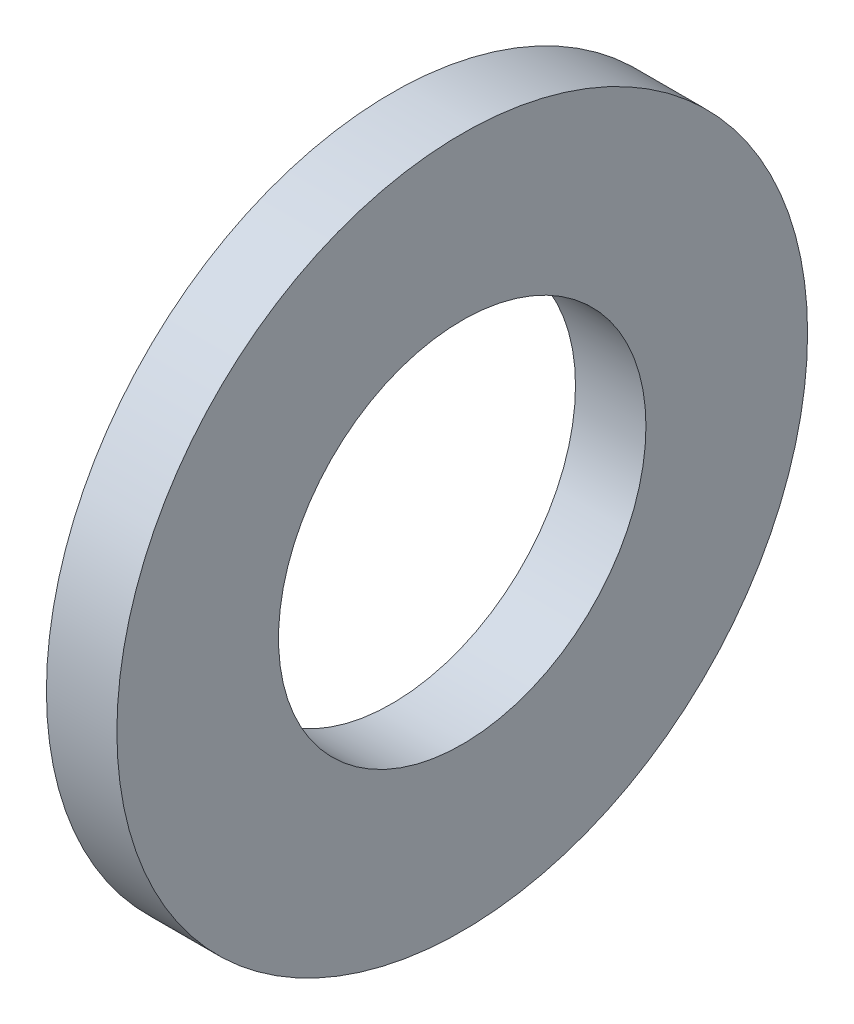
ISO-10303-21;
HEADER;
FILE_DESCRIPTION(('STEP AP214'),'2;1');
FILE_NAME('part.step','',(''),(''),'','','');
FILE_SCHEMA(('AUTOMOTIVE_DESIGN { 1 0 10303 214 1 1 1 1 }'));
ENDSEC;
DATA;
#1=APPLICATION_CONTEXT('core data for automotive mechanical design processes');
#2=APPLICATION_PROTOCOL_DEFINITION('international standard','automotive_design',2000,#1);
#3=PRODUCT_CONTEXT('',#1,'mechanical');
#4=PRODUCT('Part','Part','',(#3));
#5=PRODUCT_RELATED_PRODUCT_CATEGORY('part','',(#4));
#6=PRODUCT_DEFINITION_FORMATION('','',#4);
#7=PRODUCT_DEFINITION_CONTEXT('part definition',#1,'design');
#8=PRODUCT_DEFINITION('design','',#6,#7);
#9=PRODUCT_DEFINITION_SHAPE('','',#8);
#10=(LENGTH_UNIT() NAMED_UNIT(*) SI_UNIT(.MILLI.,.METRE.));
#11=(NAMED_UNIT(*) PLANE_ANGLE_UNIT() SI_UNIT($,.RADIAN.));
#12=(NAMED_UNIT(*) SI_UNIT($,.STERADIAN.) SOLID_ANGLE_UNIT());
#13=UNCERTAINTY_MEASURE_WITH_UNIT(LENGTH_MEASURE(1.E-05),#10,'distance_accuracy_value','');
#14=(GEOMETRIC_REPRESENTATION_CONTEXT(3) GLOBAL_UNCERTAINTY_ASSIGNED_CONTEXT((#13)) GLOBAL_UNIT_ASSIGNED_CONTEXT((#10,
#11,#12)) REPRESENTATION_CONTEXT('',''));
#15=CARTESIAN_POINT('',(0.,0.,0.));
#16=DIRECTION('',(0.,0.,1.));
#17=DIRECTION('',(1.,0.,0.));
#18=AXIS2_PLACEMENT_3D('',#15,#16,#17);
#19=CARTESIAN_POINT('',(1.2954,0.,0.));
#20=DIRECTION('',(1.,0.,0.));
#21=DIRECTION('',(0.,0.,-1.));
#22=AXIS2_PLACEMENT_3D('',#19,#20,#21);
#23=PLANE('',#22);
#24=CARTESIAN_POINT('',(1.2954,0.,0.));
#25=DIRECTION('',(1.,0.,0.));
#26=DIRECTION('',(0.,0.,-1.));
#27=AXIS2_PLACEMENT_3D('',#24,#25,#26);
#28=CIRCLE('',#27,6.35);
#29=CARTESIAN_POINT('',(1.2954,0.,-6.35));
#30=VERTEX_POINT('',#29);
#31=EDGE_CURVE('E10',#30,#30,#28,.T.);
#32=ORIENTED_EDGE('',*,*,#31,.T.);
#33=EDGE_LOOP('',(#32));
#34=FACE_BOUND('',#33,.T.);
#35=CARTESIAN_POINT('',(1.2954,0.,0.));
#36=DIRECTION('',(1.,0.,0.));
#37=DIRECTION('',(0.,0.,-1.));
#38=AXIS2_PLACEMENT_3D('',#35,#36,#37);
#39=CIRCLE('',#38,3.3782);
#40=CARTESIAN_POINT('',(1.2954,0.,-3.3782));
#41=VERTEX_POINT('',#40);
#42=EDGE_CURVE('E44',#41,#41,#39,.T.);
#43=ORIENTED_EDGE('',*,*,#42,.F.);
#44=EDGE_LOOP('',(#43));
#45=FACE_BOUND('',#44,.T.);
#46=ADVANCED_FACE('F33',(#34,#45),#23,.T.);
#47=CARTESIAN_POINT('',(0.,0.,0.));
#48=DIRECTION('',(1.,0.,0.));
#49=DIRECTION('',(0.,0.,-1.));
#50=AXIS2_PLACEMENT_3D('',#47,#48,#49);
#51=PLANE('',#50);
#52=CARTESIAN_POINT('',(0.,0.,0.));
#53=DIRECTION('',(1.,0.,0.));
#54=DIRECTION('',(0.,0.,-1.));
#55=AXIS2_PLACEMENT_3D('',#52,#53,#54);
#56=CIRCLE('',#55,6.35);
#57=CARTESIAN_POINT('',(0.,0.,-6.35));
#58=VERTEX_POINT('',#57);
#59=EDGE_CURVE('E37',#58,#58,#56,.T.);
#60=ORIENTED_EDGE('',*,*,#59,.F.);
#61=EDGE_LOOP('',(#60));
#62=FACE_BOUND('',#61,.T.);
#63=CARTESIAN_POINT('',(0.,0.,0.));
#64=DIRECTION('',(1.,0.,0.));
#65=DIRECTION('',(0.,0.,-1.));
#66=AXIS2_PLACEMENT_3D('',#63,#64,#65);
#67=CIRCLE('',#66,3.3782);
#68=CARTESIAN_POINT('',(0.,0.,-3.3782));
#69=VERTEX_POINT('',#68);
#70=EDGE_CURVE('E46',#69,#69,#67,.T.);
#71=ORIENTED_EDGE('',*,*,#70,.T.);
#72=EDGE_LOOP('',(#71));
#73=FACE_BOUND('',#72,.T.);
#74=ADVANCED_FACE('F56',(#62,#73),#51,.F.);
#75=CARTESIAN_POINT('',(1.2954,0.,0.));
#76=DIRECTION('',(-1.,0.,0.));
#77=DIRECTION('',(0.,0.,1.));
#78=AXIS2_PLACEMENT_3D('',#75,#76,#77);
#79=CYLINDRICAL_SURFACE('',#78,6.35);
#80=ORIENTED_EDGE('',*,*,#31,.F.);
#81=EDGE_LOOP('',(#80));
#82=FACE_BOUND('',#81,.T.);
#83=ORIENTED_EDGE('',*,*,#59,.T.);
#84=EDGE_LOOP('',(#83));
#85=FACE_BOUND('',#84,.T.);
#86=ADVANCED_FACE('F35',(#82,#85),#79,.T.);
#87=CARTESIAN_POINT('',(1.2954,0.,0.));
#88=DIRECTION('',(-1.,0.,0.));
#89=DIRECTION('',(0.,0.,1.));
#90=AXIS2_PLACEMENT_3D('',#87,#88,#89);
#91=CYLINDRICAL_SURFACE('',#90,3.3782);
#92=ORIENTED_EDGE('',*,*,#42,.T.);
#93=EDGE_LOOP('',(#92));
#94=FACE_BOUND('',#93,.T.);
#95=ORIENTED_EDGE('',*,*,#70,.F.);
#96=EDGE_LOOP('',(#95));
#97=FACE_BOUND('',#96,.T.);
#98=ADVANCED_FACE('F52',(#94,#97),#91,.F.);
#99=CLOSED_SHELL('',(#46,#74,#86,#98));
#100=MANIFOLD_SOLID_BREP('B2',#99);
#101=ADVANCED_BREP_SHAPE_REPRESENTATION('',(#18,#100),#14);
#102=SHAPE_DEFINITION_REPRESENTATION(#9,#101);
ENDSEC;
END-ISO-10303-21;
